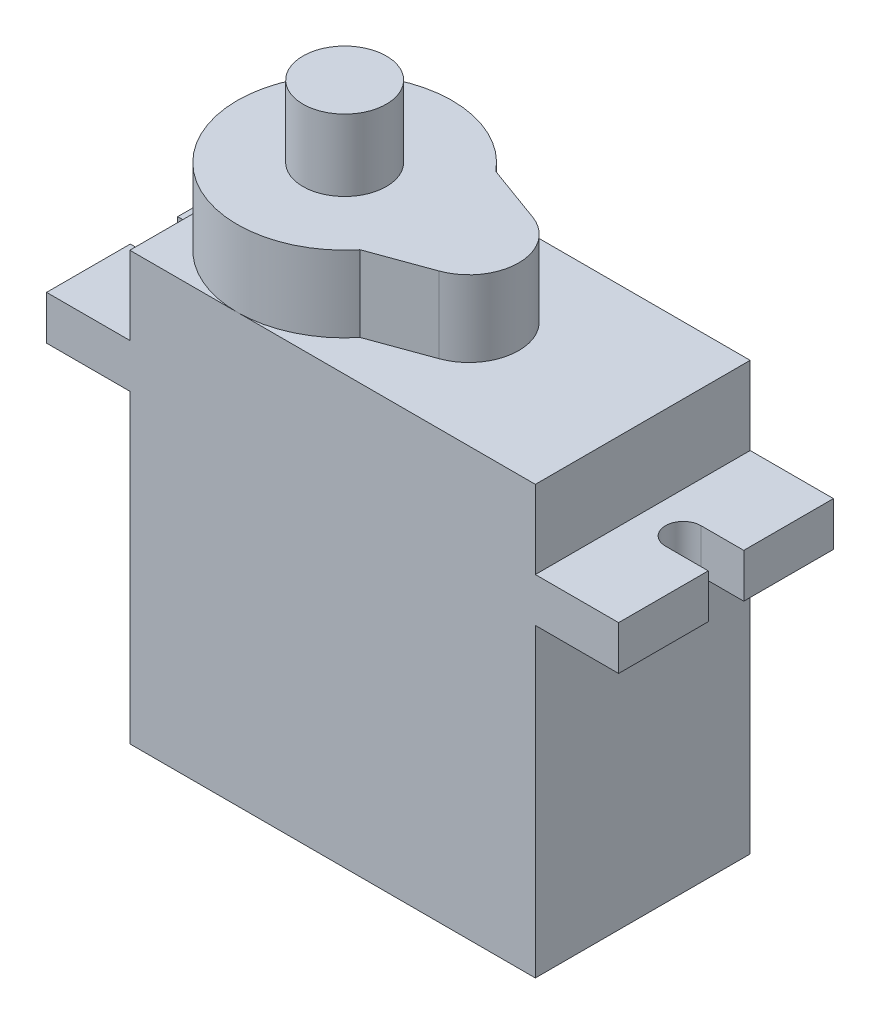
ISO-10303-21;
HEADER;
FILE_DESCRIPTION(('STEP AP214'),'2;1');
FILE_NAME('part.step','',(''),(''),'','','');
FILE_SCHEMA(('AUTOMOTIVE_DESIGN { 1 0 10303 214 1 1 1 1 }'));
ENDSEC;
DATA;
#1=APPLICATION_CONTEXT('core data for automotive mechanical design processes');
#2=APPLICATION_PROTOCOL_DEFINITION('international standard','automotive_design',2000,#1);
#3=PRODUCT_CONTEXT('',#1,'mechanical');
#4=PRODUCT('Part','Part','',(#3));
#5=PRODUCT_RELATED_PRODUCT_CATEGORY('part','',(#4));
#6=PRODUCT_DEFINITION_FORMATION('','',#4);
#7=PRODUCT_DEFINITION_CONTEXT('part definition',#1,'design');
#8=PRODUCT_DEFINITION('design','',#6,#7);
#9=PRODUCT_DEFINITION_SHAPE('','',#8);
#10=(LENGTH_UNIT() NAMED_UNIT(*) SI_UNIT(.MILLI.,.METRE.));
#11=(NAMED_UNIT(*) PLANE_ANGLE_UNIT() SI_UNIT($,.RADIAN.));
#12=(NAMED_UNIT(*) SI_UNIT($,.STERADIAN.) SOLID_ANGLE_UNIT());
#13=UNCERTAINTY_MEASURE_WITH_UNIT(LENGTH_MEASURE(1.E-05),#10,'distance_accuracy_value','');
#14=(GEOMETRIC_REPRESENTATION_CONTEXT(3) GLOBAL_UNCERTAINTY_ASSIGNED_CONTEXT((#13)) GLOBAL_UNIT_ASSIGNED_CONTEXT((#10,
#11,#12)) REPRESENTATION_CONTEXT('',''));
#15=CARTESIAN_POINT('',(0.,0.,0.));
#16=DIRECTION('',(0.,0.,1.));
#17=DIRECTION('',(1.,0.,0.));
#18=AXIS2_PLACEMENT_3D('',#15,#16,#17);
#19=CARTESIAN_POINT('',(0.,6.88,0.));
#20=DIRECTION('',(0.,1.,0.));
#21=DIRECTION('',(0.,0.,1.));
#22=AXIS2_PLACEMENT_3D('',#19,#20,#21);
#23=PLANE('',#22);
#24=CARTESIAN_POINT('',(0.,6.88,0.));
#25=DIRECTION('',(0.,1.,0.));
#26=DIRECTION('',(0.,0.,1.));
#27=AXIS2_PLACEMENT_3D('',#24,#25,#26);
#28=CIRCLE('',#27,6.05);
#29=CARTESIAN_POINT('',(4.69157810051004,6.88,-3.81989462247515));
#30=VERTEX_POINT('',#29);
#31=CARTESIAN_POINT('',(0.,6.88,-6.05));
#32=VERTEX_POINT('',#31);
#33=EDGE_CURVE('E50',#30,#32,#28,.T.);
#34=ORIENTED_EDGE('',*,*,#33,.F.);
#35=DIRECTION('',(0.939692620785908,0.,0.34202014332567));
#36=VECTOR('',#35,1.);
#37=CARTESIAN_POINT('',(1.77650085039546,6.88,-4.88089597210344));
#38=LINE('',#37,#36);
#39=CARTESIAN_POINT('',(7.95765640131187,6.88,-2.63113933820054));
#40=VERTEX_POINT('',#39);
#41=EDGE_CURVE('E57',#30,#40,#38,.T.);
#42=ORIENTED_EDGE('',*,*,#41,.T.);
#43=CARTESIAN_POINT('',(7.,6.88,0.));
#44=DIRECTION('',(0.,1.,0.));
#45=DIRECTION('',(0.,0.,1.));
#46=AXIS2_PLACEMENT_3D('',#43,#44,#45);
#47=CIRCLE('',#46,2.8);
#48=CARTESIAN_POINT('',(7.95765640131187,6.88,2.63113933820054));
#49=VERTEX_POINT('',#48);
#50=EDGE_CURVE('E62',#49,#40,#47,.T.);
#51=ORIENTED_EDGE('',*,*,#50,.F.);
#52=DIRECTION('',(0.939692620785908,0.,-0.34202014332567));
#53=VECTOR('',#52,1.);
#54=CARTESIAN_POINT('',(1.77650085039546,6.88,4.88089597210344));
#55=LINE('',#54,#53);
#56=CARTESIAN_POINT('',(4.69157810051004,6.88,3.81989462247515));
#57=VERTEX_POINT('',#56);
#58=EDGE_CURVE('E234',#57,#49,#55,.T.);
#59=ORIENTED_EDGE('',*,*,#58,.F.);
#60=CARTESIAN_POINT('',(0.,6.88,6.05));
#61=VERTEX_POINT('',#60);
#62=EDGE_CURVE('E235',#61,#57,#28,.T.);
#63=ORIENTED_EDGE('',*,*,#62,.F.);
#64=DIRECTION('',(-1.,0.,0.));
#65=VECTOR('',#64,1.);
#66=CARTESIAN_POINT('',(0.,6.88,6.05));
#67=LINE('',#66,#65);
#68=CARTESIAN_POINT('',(16.79,6.88,6.05));
#69=VERTEX_POINT('',#68);
#70=EDGE_CURVE('E263',#69,#61,#67,.T.);
#71=ORIENTED_EDGE('',*,*,#70,.F.);
#72=DIRECTION('',(0.,0.,-1.));
#73=VECTOR('',#72,1.);
#74=CARTESIAN_POINT('',(16.79,6.88,0.));
#75=LINE('',#74,#73);
#76=CARTESIAN_POINT('',(16.79,6.88,-6.05));
#77=VERTEX_POINT('',#76);
#78=EDGE_CURVE('E260',#69,#77,#75,.T.);
#79=ORIENTED_EDGE('',*,*,#78,.T.);
#80=DIRECTION('',(-1.,0.,0.));
#81=VECTOR('',#80,1.);
#82=CARTESIAN_POINT('',(0.,6.88,-6.05));
#83=LINE('',#82,#81);
#84=EDGE_CURVE('E257',#77,#32,#83,.T.);
#85=ORIENTED_EDGE('',*,*,#84,.T.);
#86=EDGE_LOOP('',(#34,#42,#51,#59,#63,#71,#79,#85));
#87=FACE_BOUND('',#86,.T.);
#88=ADVANCED_FACE('F39',(#87),#23,.T.);
#89=CARTESIAN_POINT('',(-6.05,6.88,0.));
#90=VERTEX_POINT('',#89);
#91=EDGE_CURVE('E11',#32,#90,#28,.T.);
#92=ORIENTED_EDGE('',*,*,#91,.F.);
#93=CARTESIAN_POINT('',(-6.05,6.88,-6.05));
#94=VERTEX_POINT('',#93);
#95=EDGE_CURVE('E255',#32,#94,#83,.T.);
#96=ORIENTED_EDGE('',*,*,#95,.T.);
#97=DIRECTION('',(0.,0.,-1.));
#98=VECTOR('',#97,1.);
#99=CARTESIAN_POINT('',(-6.05,6.88,0.));
#100=LINE('',#99,#98);
#101=EDGE_CURVE('E256',#90,#94,#100,.T.);
#102=ORIENTED_EDGE('',*,*,#101,.F.);
#103=EDGE_LOOP('',(#92,#96,#102));
#104=FACE_BOUND('',#103,.T.);
#105=ADVANCED_FACE('F411',(#104),#23,.T.);
#106=CARTESIAN_POINT('',(0.,2.48,0.));
#107=DIRECTION('',(0.,1.,0.));
#108=DIRECTION('',(0.,0.,1.));
#109=AXIS2_PLACEMENT_3D('',#106,#107,#108);
#110=PLANE('',#109);
#111=DIRECTION('',(1.,0.,0.));
#112=VECTOR('',#111,1.);
#113=CARTESIAN_POINT('',(0.,2.48,6.05));
#114=LINE('',#113,#112);
#115=CARTESIAN_POINT('',(-10.74,2.48,6.05));
#116=VERTEX_POINT('',#115);
#117=CARTESIAN_POINT('',(-6.05,2.48,6.05));
#118=VERTEX_POINT('',#117);
#119=EDGE_CURVE('E293',#116,#118,#114,.T.);
#120=ORIENTED_EDGE('',*,*,#119,.T.);
#121=DIRECTION('',(0.,0.,-1.));
#122=VECTOR('',#121,1.);
#123=CARTESIAN_POINT('',(-6.05,2.48,0.));
#124=LINE('',#123,#122);
#125=CARTESIAN_POINT('',(-6.05,2.48,-6.05));
#126=VERTEX_POINT('',#125);
#127=EDGE_CURVE('E247',#118,#126,#124,.T.);
#128=ORIENTED_EDGE('',*,*,#127,.T.);
#129=DIRECTION('',(1.,0.,0.));
#130=VECTOR('',#129,1.);
#131=CARTESIAN_POINT('',(0.,2.48,-6.05));
#132=LINE('',#131,#130);
#133=CARTESIAN_POINT('',(-10.74,2.48,-6.05));
#134=VERTEX_POINT('',#133);
#135=EDGE_CURVE('E296',#134,#126,#132,.T.);
#136=ORIENTED_EDGE('',*,*,#135,.F.);
#137=DIRECTION('',(0.,0.,1.));
#138=VECTOR('',#137,1.);
#139=CARTESIAN_POINT('',(-10.74,2.48,0.));
#140=LINE('',#139,#138);
#141=CARTESIAN_POINT('',(-10.74,2.48,-1.33332999047523));
#142=VERTEX_POINT('',#141);
#143=EDGE_CURVE('E292',#134,#142,#140,.T.);
#144=ORIENTED_EDGE('',*,*,#143,.T.);
#145=DIRECTION('',(-1.,0.,0.));
#146=VECTOR('',#145,1.);
#147=CARTESIAN_POINT('',(0.,2.48,-1.33332999047523));
#148=LINE('',#147,#146);
#149=CARTESIAN_POINT('',(-8.33,2.48,-1.33332999047523));
#150=VERTEX_POINT('',#149);
#151=EDGE_CURVE('E299',#150,#142,#148,.T.);
#152=ORIENTED_EDGE('',*,*,#151,.F.);
#153=CARTESIAN_POINT('',(-8.33,2.48,0.));
#154=DIRECTION('',(0.,1.,0.));
#155=DIRECTION('',(0.,0.,1.));
#156=AXIS2_PLACEMENT_3D('',#153,#154,#155);
#157=CIRCLE('',#156,1.33332999047523);
#158=CARTESIAN_POINT('',(-8.33,2.48,1.33332999047523));
#159=VERTEX_POINT('',#158);
#160=EDGE_CURVE('E283',#159,#150,#157,.T.);
#161=ORIENTED_EDGE('',*,*,#160,.F.);
#162=DIRECTION('',(-1.,0.,0.));
#163=VECTOR('',#162,1.);
#164=CARTESIAN_POINT('',(0.,2.48,1.33332999047523));
#165=LINE('',#164,#163);
#166=CARTESIAN_POINT('',(-10.74,2.48,1.33332999047523));
#167=VERTEX_POINT('',#166);
#168=EDGE_CURVE('E286',#159,#167,#165,.T.);
#169=ORIENTED_EDGE('',*,*,#168,.T.);
#170=EDGE_CURVE('E289',#167,#116,#140,.T.);
#171=ORIENTED_EDGE('',*,*,#170,.T.);
#172=EDGE_LOOP('',(#120,#128,#136,#144,#152,#161,#169,#171));
#173=FACE_BOUND('',#172,.T.);
#174=ADVANCED_FACE('F432',(#173),#110,.T.);
#175=CARTESIAN_POINT('',(-6.05,-17.2,-6.05));
#176=DIRECTION('',(0.,0.,1.));
#177=DIRECTION('',(1.,0.,0.));
#178=AXIS2_PLACEMENT_3D('',#175,#176,#177);
#179=PLANE('',#178);
#180=DIRECTION('',(0.,1.,0.));
#181=VECTOR('',#180,1.);
#182=CARTESIAN_POINT('',(-6.05,-17.2,-6.05));
#183=LINE('',#182,#181);
#184=CARTESIAN_POINT('',(-6.05,-17.2,-6.05));
#185=VERTEX_POINT('',#184);
#186=CARTESIAN_POINT('',(-6.05,0.,-6.05));
#187=VERTEX_POINT('',#186);
#188=EDGE_CURVE('E384',#185,#187,#183,.T.);
#189=ORIENTED_EDGE('',*,*,#188,.T.);
#190=DIRECTION('',(1.,0.,0.));
#191=VECTOR('',#190,1.);
#192=CARTESIAN_POINT('',(0.,0.,-6.05));
#193=LINE('',#192,#191);
#194=CARTESIAN_POINT('',(-10.74,0.,-6.05));
#195=VERTEX_POINT('',#194);
#196=EDGE_CURVE('E317',#195,#187,#193,.T.);
#197=ORIENTED_EDGE('',*,*,#196,.F.);
#198=DIRECTION('',(0.,-1.,0.));
#199=VECTOR('',#198,1.);
#200=CARTESIAN_POINT('',(-10.74,2.48,-6.05));
#201=LINE('',#200,#199);
#202=EDGE_CURVE('E324',#134,#195,#201,.T.);
#203=ORIENTED_EDGE('',*,*,#202,.F.);
#204=ORIENTED_EDGE('',*,*,#135,.T.);
#205=DIRECTION('',(0.,-1.,0.));
#206=VECTOR('',#205,1.);
#207=CARTESIAN_POINT('',(-6.05,6.88,-6.05));
#208=LINE('',#207,#206);
#209=EDGE_CURVE('E266',#94,#126,#208,.T.);
#210=ORIENTED_EDGE('',*,*,#209,.F.);
#211=ORIENTED_EDGE('',*,*,#95,.F.);
#212=ORIENTED_EDGE('',*,*,#84,.F.);
#213=DIRECTION('',(0.,-1.,0.));
#214=VECTOR('',#213,1.);
#215=CARTESIAN_POINT('',(16.79,6.88,-6.05));
#216=LINE('',#215,#214);
#217=CARTESIAN_POINT('',(16.79,2.48,-6.05));
#218=VERTEX_POINT('',#217);
#219=EDGE_CURVE('E278',#77,#218,#216,.T.);
#220=ORIENTED_EDGE('',*,*,#219,.T.);
#221=CARTESIAN_POINT('',(21.48,2.48,-6.05));
#222=VERTEX_POINT('',#221);
#223=EDGE_CURVE('E295',#218,#222,#132,.T.);
#224=ORIENTED_EDGE('',*,*,#223,.T.);
#225=DIRECTION('',(0.,-1.,0.));
#226=VECTOR('',#225,1.);
#227=CARTESIAN_POINT('',(21.48,2.48,-6.05));
#228=LINE('',#227,#226);
#229=CARTESIAN_POINT('',(21.48,0.,-6.05));
#230=VERTEX_POINT('',#229);
#231=EDGE_CURVE('E366',#222,#230,#228,.T.);
#232=ORIENTED_EDGE('',*,*,#231,.T.);
#233=CARTESIAN_POINT('',(16.79,0.,-6.05));
#234=VERTEX_POINT('',#233);
#235=EDGE_CURVE('E316',#234,#230,#193,.T.);
#236=ORIENTED_EDGE('',*,*,#235,.F.);
#237=DIRECTION('',(0.,1.,0.));
#238=VECTOR('',#237,1.);
#239=CARTESIAN_POINT('',(16.79,-17.2,-6.05));
#240=LINE('',#239,#238);
#241=CARTESIAN_POINT('',(16.79,-17.2,-6.05));
#242=VERTEX_POINT('',#241);
#243=EDGE_CURVE('E43',#242,#234,#240,.T.);
#244=ORIENTED_EDGE('',*,*,#243,.F.);
#245=DIRECTION('',(1.,0.,0.));
#246=VECTOR('',#245,1.);
#247=CARTESIAN_POINT('',(-6.05,-17.2,-6.05));
#248=LINE('',#247,#246);
#249=EDGE_CURVE('E372',#185,#242,#248,.T.);
#250=ORIENTED_EDGE('',*,*,#249,.F.);
#251=EDGE_LOOP('',(#189,#197,#203,#204,#210,#211,#212,#220,#224,#232,#236,#244,#250));
#252=FACE_BOUND('',#251,.T.);
#253=ADVANCED_FACE('F41',(#252),#179,.F.);
#254=CARTESIAN_POINT('',(16.79,-17.2,-6.05));
#255=DIRECTION('',(-1.,0.,0.));
#256=DIRECTION('',(0.,0.,1.));
#257=AXIS2_PLACEMENT_3D('',#254,#255,#256);
#258=PLANE('',#257);
#259=DIRECTION('',(0.,0.,1.));
#260=VECTOR('',#259,1.);
#261=CARTESIAN_POINT('',(16.79,0.,-6.05));
#262=LINE('',#261,#260);
#263=CARTESIAN_POINT('',(16.79,0.,6.05));
#264=VERTEX_POINT('',#263);
#265=EDGE_CURVE('E334',#234,#264,#262,.T.);
#266=ORIENTED_EDGE('',*,*,#265,.T.);
#267=DIRECTION('',(0.,1.,0.));
#268=VECTOR('',#267,1.);
#269=CARTESIAN_POINT('',(16.79,-17.2,6.05));
#270=LINE('',#269,#268);
#271=CARTESIAN_POINT('',(16.79,-17.2,6.05));
#272=VERTEX_POINT('',#271);
#273=EDGE_CURVE('E392',#272,#264,#270,.T.);
#274=ORIENTED_EDGE('',*,*,#273,.F.);
#275=DIRECTION('',(0.,0.,1.));
#276=VECTOR('',#275,1.);
#277=CARTESIAN_POINT('',(16.79,-17.2,-6.05));
#278=LINE('',#277,#276);
#279=EDGE_CURVE('E375',#242,#272,#278,.T.);
#280=ORIENTED_EDGE('',*,*,#279,.F.);
#281=ORIENTED_EDGE('',*,*,#243,.T.);
#282=EDGE_LOOP('',(#266,#274,#280,#281));
#283=FACE_BOUND('',#282,.T.);
#284=ADVANCED_FACE('F456',(#283),#258,.F.);
#285=CARTESIAN_POINT('',(-6.05,-17.2,6.05));
#286=DIRECTION('',(0.,0.,1.));
#287=DIRECTION('',(1.,0.,0.));
#288=AXIS2_PLACEMENT_3D('',#285,#286,#287);
#289=PLANE('',#288);
#290=ORIENTED_EDGE('',*,*,#273,.T.);
#291=DIRECTION('',(1.,0.,0.));
#292=VECTOR('',#291,1.);
#293=CARTESIAN_POINT('',(0.,0.,6.05));
#294=LINE('',#293,#292);
#295=CARTESIAN_POINT('',(21.48,0.,6.05));
#296=VERTEX_POINT('',#295);
#297=EDGE_CURVE('E311',#264,#296,#294,.T.);
#298=ORIENTED_EDGE('',*,*,#297,.T.);
#299=DIRECTION('',(0.,-1.,0.));
#300=VECTOR('',#299,1.);
#301=CARTESIAN_POINT('',(21.48,2.48,6.05));
#302=LINE('',#301,#300);
#303=CARTESIAN_POINT('',(21.48,2.48,6.05));
#304=VERTEX_POINT('',#303);
#305=EDGE_CURVE('E363',#304,#296,#302,.T.);
#306=ORIENTED_EDGE('',*,*,#305,.F.);
#307=CARTESIAN_POINT('',(16.79,2.48,6.05));
#308=VERTEX_POINT('',#307);
#309=EDGE_CURVE('E291',#308,#304,#114,.T.);
#310=ORIENTED_EDGE('',*,*,#309,.F.);
#311=DIRECTION('',(0.,-1.,0.));
#312=VECTOR('',#311,1.);
#313=CARTESIAN_POINT('',(16.79,6.88,6.05));
#314=LINE('',#313,#312);
#315=EDGE_CURVE('E275',#69,#308,#314,.T.);
#316=ORIENTED_EDGE('',*,*,#315,.F.);
#317=ORIENTED_EDGE('',*,*,#70,.T.);
#318=CARTESIAN_POINT('',(-6.05,6.88,6.05));
#319=VERTEX_POINT('',#318);
#320=EDGE_CURVE('E262',#61,#319,#67,.T.);
#321=ORIENTED_EDGE('',*,*,#320,.T.);
#322=DIRECTION('',(0.,-1.,0.));
#323=VECTOR('',#322,1.);
#324=CARTESIAN_POINT('',(-6.05,6.88,6.05));
#325=LINE('',#324,#323);
#326=EDGE_CURVE('E271',#319,#118,#325,.T.);
#327=ORIENTED_EDGE('',*,*,#326,.T.);
#328=ORIENTED_EDGE('',*,*,#119,.F.);
#329=DIRECTION('',(0.,-1.,0.));
#330=VECTOR('',#329,1.);
#331=CARTESIAN_POINT('',(-10.74,2.48,6.05));
#332=LINE('',#331,#330);
#333=CARTESIAN_POINT('',(-10.74,0.,6.05));
#334=VERTEX_POINT('',#333);
#335=EDGE_CURVE('E326',#116,#334,#332,.T.);
#336=ORIENTED_EDGE('',*,*,#335,.T.);
#337=CARTESIAN_POINT('',(-6.05,0.,6.05));
#338=VERTEX_POINT('',#337);
#339=EDGE_CURVE('E313',#334,#338,#294,.T.);
#340=ORIENTED_EDGE('',*,*,#339,.T.);
#341=DIRECTION('',(0.,1.,0.));
#342=VECTOR('',#341,1.);
#343=CARTESIAN_POINT('',(-6.05,-17.2,6.05));
#344=LINE('',#343,#342);
#345=CARTESIAN_POINT('',(-6.05,-17.2,6.05));
#346=VERTEX_POINT('',#345);
#347=EDGE_CURVE('E390',#346,#338,#344,.T.);
#348=ORIENTED_EDGE('',*,*,#347,.F.);
#349=DIRECTION('',(1.,0.,0.));
#350=VECTOR('',#349,1.);
#351=CARTESIAN_POINT('',(-6.05,-17.2,6.05));
#352=LINE('',#351,#350);
#353=EDGE_CURVE('E378',#346,#272,#352,.T.);
#354=ORIENTED_EDGE('',*,*,#353,.T.);
#355=EDGE_LOOP('',(#290,#298,#306,#310,#316,#317,#321,#327,#328,#336,#340,#348,#354));
#356=FACE_BOUND('',#355,.T.);
#357=ADVANCED_FACE('F419',(#356),#289,.T.);
#358=CARTESIAN_POINT('',(-6.05,-17.2,-6.05));
#359=DIRECTION('',(-1.,0.,0.));
#360=DIRECTION('',(0.,0.,1.));
#361=AXIS2_PLACEMENT_3D('',#358,#359,#360);
#362=PLANE('',#361);
#363=DIRECTION('',(0.,0.,1.));
#364=VECTOR('',#363,1.);
#365=CARTESIAN_POINT('',(-6.05,0.,-6.05));
#366=LINE('',#365,#364);
#367=EDGE_CURVE('E376',#187,#338,#366,.T.);
#368=ORIENTED_EDGE('',*,*,#367,.F.);
#369=ORIENTED_EDGE('',*,*,#188,.F.);
#370=DIRECTION('',(0.,0.,1.));
#371=VECTOR('',#370,1.);
#372=CARTESIAN_POINT('',(-6.05,-17.2,-6.05));
#373=LINE('',#372,#371);
#374=EDGE_CURVE('E381',#185,#346,#373,.T.);
#375=ORIENTED_EDGE('',*,*,#374,.T.);
#376=ORIENTED_EDGE('',*,*,#347,.T.);
#377=EDGE_LOOP('',(#368,#369,#375,#376));
#378=FACE_BOUND('',#377,.T.);
#379=ADVANCED_FACE('F450',(#378),#362,.T.);
#380=CARTESIAN_POINT('',(0.,-17.2,0.));
#381=DIRECTION('',(0.,-1.,0.));
#382=DIRECTION('',(0.,0.,-1.));
#383=AXIS2_PLACEMENT_3D('',#380,#381,#382);
#384=PLANE('',#383);
#385=ORIENTED_EDGE('',*,*,#249,.T.);
#386=ORIENTED_EDGE('',*,*,#279,.T.);
#387=ORIENTED_EDGE('',*,*,#353,.F.);
#388=ORIENTED_EDGE('',*,*,#374,.F.);
#389=EDGE_LOOP('',(#385,#386,#387,#388));
#390=FACE_BOUND('',#389,.T.);
#391=ADVANCED_FACE('F455',(#390),#384,.T.);
#392=CARTESIAN_POINT('',(0.,0.,0.));
#393=DIRECTION('',(0.,1.,0.));
#394=DIRECTION('',(0.,0.,1.));
#395=AXIS2_PLACEMENT_3D('',#392,#393,#394);
#396=PLANE('',#395);
#397=ORIENTED_EDGE('',*,*,#196,.T.);
#398=ORIENTED_EDGE('',*,*,#367,.T.);
#399=ORIENTED_EDGE('',*,*,#339,.F.);
#400=DIRECTION('',(0.,0.,1.));
#401=VECTOR('',#400,1.);
#402=CARTESIAN_POINT('',(-10.74,0.,0.));
#403=LINE('',#402,#401);
#404=CARTESIAN_POINT('',(-10.74,0.,1.33332999047523));
#405=VERTEX_POINT('',#404);
#406=EDGE_CURVE('E309',#405,#334,#403,.T.);
#407=ORIENTED_EDGE('',*,*,#406,.F.);
#408=DIRECTION('',(-1.,0.,0.));
#409=VECTOR('',#408,1.);
#410=CARTESIAN_POINT('',(0.,0.,1.33332999047523));
#411=LINE('',#410,#409);
#412=CARTESIAN_POINT('',(-8.33,0.,1.33332999047523));
#413=VERTEX_POINT('',#412);
#414=EDGE_CURVE('E306',#413,#405,#411,.T.);
#415=ORIENTED_EDGE('',*,*,#414,.F.);
#416=CARTESIAN_POINT('',(-8.33,0.,0.));
#417=DIRECTION('',(0.,1.,0.));
#418=DIRECTION('',(0.,0.,1.));
#419=AXIS2_PLACEMENT_3D('',#416,#417,#418);
#420=CIRCLE('',#419,1.33332999047523);
#421=CARTESIAN_POINT('',(-8.33,0.,-1.33332999047523));
#422=VERTEX_POINT('',#421);
#423=EDGE_CURVE('E303',#413,#422,#420,.T.);
#424=ORIENTED_EDGE('',*,*,#423,.T.);
#425=DIRECTION('',(-1.,0.,0.));
#426=VECTOR('',#425,1.);
#427=CARTESIAN_POINT('',(0.,0.,-1.33332999047523));
#428=LINE('',#427,#426);
#429=CARTESIAN_POINT('',(-10.74,0.,-1.33332999047523));
#430=VERTEX_POINT('',#429);
#431=EDGE_CURVE('E287',#422,#430,#428,.T.);
#432=ORIENTED_EDGE('',*,*,#431,.T.);
#433=EDGE_CURVE('E312',#195,#430,#403,.T.);
#434=ORIENTED_EDGE('',*,*,#433,.F.);
#435=EDGE_LOOP('',(#397,#398,#399,#407,#415,#424,#432,#434));
#436=FACE_BOUND('',#435,.T.);
#437=ADVANCED_FACE('F445',(#436),#396,.F.);
#438=CARTESIAN_POINT('',(-8.33,2.48,0.));
#439=DIRECTION('',(0.,-1.,0.));
#440=DIRECTION('',(0.,0.,-1.));
#441=AXIS2_PLACEMENT_3D('',#438,#439,#440);
#442=CYLINDRICAL_SURFACE('',#441,1.33332999047523);
#443=ORIENTED_EDGE('',*,*,#423,.F.);
#444=DIRECTION('',(0.,-1.,0.));
#445=VECTOR('',#444,1.);
#446=CARTESIAN_POINT('',(-8.33,2.48,1.33332999047523));
#447=LINE('',#446,#445);
#448=EDGE_CURVE('E332',#159,#413,#447,.T.);
#449=ORIENTED_EDGE('',*,*,#448,.F.);
#450=ORIENTED_EDGE('',*,*,#160,.T.);
#451=DIRECTION('',(0.,-1.,0.));
#452=VECTOR('',#451,1.);
#453=CARTESIAN_POINT('',(-8.33,2.48,-1.33332999047523));
#454=LINE('',#453,#452);
#455=EDGE_CURVE('E302',#150,#422,#454,.T.);
#456=ORIENTED_EDGE('',*,*,#455,.T.);
#457=EDGE_LOOP('',(#443,#449,#450,#456));
#458=FACE_BOUND('',#457,.T.);
#459=ADVANCED_FACE('F529',(#458),#442,.F.);
#460=CARTESIAN_POINT('',(0.,2.48,1.33332999047523));
#461=DIRECTION('',(0.,0.,1.));
#462=DIRECTION('',(1.,0.,0.));
#463=AXIS2_PLACEMENT_3D('',#460,#461,#462);
#464=PLANE('',#463);
#465=ORIENTED_EDGE('',*,*,#414,.T.);
#466=DIRECTION('',(0.,-1.,0.));
#467=VECTOR('',#466,1.);
#468=CARTESIAN_POINT('',(-10.74,2.48,1.33332999047523));
#469=LINE('',#468,#467);
#470=EDGE_CURVE('E329',#167,#405,#469,.T.);
#471=ORIENTED_EDGE('',*,*,#470,.F.);
#472=ORIENTED_EDGE('',*,*,#168,.F.);
#473=ORIENTED_EDGE('',*,*,#448,.T.);
#474=EDGE_LOOP('',(#465,#471,#472,#473));
#475=FACE_BOUND('',#474,.T.);
#476=ADVANCED_FACE('F526',(#475),#464,.F.);
#477=CARTESIAN_POINT('',(-10.74,2.48,0.));
#478=DIRECTION('',(1.,0.,0.));
#479=DIRECTION('',(0.,0.,-1.));
#480=AXIS2_PLACEMENT_3D('',#477,#478,#479);
#481=PLANE('',#480);
#482=ORIENTED_EDGE('',*,*,#406,.T.);
#483=ORIENTED_EDGE('',*,*,#335,.F.);
#484=ORIENTED_EDGE('',*,*,#170,.F.);
#485=ORIENTED_EDGE('',*,*,#470,.T.);
#486=EDGE_LOOP('',(#482,#483,#484,#485));
#487=FACE_BOUND('',#486,.T.);
#488=ADVANCED_FACE('F441',(#487),#481,.F.);
#489=ORIENTED_EDGE('',*,*,#433,.T.);
#490=DIRECTION('',(0.,-1.,0.));
#491=VECTOR('',#490,1.);
#492=CARTESIAN_POINT('',(-10.74,2.48,-1.33332999047523));
#493=LINE('',#492,#491);
#494=EDGE_CURVE('E322',#142,#430,#493,.T.);
#495=ORIENTED_EDGE('',*,*,#494,.F.);
#496=ORIENTED_EDGE('',*,*,#143,.F.);
#497=ORIENTED_EDGE('',*,*,#202,.T.);
#498=EDGE_LOOP('',(#489,#495,#496,#497));
#499=FACE_BOUND('',#498,.T.);
#500=ADVANCED_FACE('F521',(#499),#481,.F.);
#501=CARTESIAN_POINT('',(0.,2.48,-1.33332999047523));
#502=DIRECTION('',(0.,0.,1.));
#503=DIRECTION('',(1.,0.,0.));
#504=AXIS2_PLACEMENT_3D('',#501,#502,#503);
#505=PLANE('',#504);
#506=ORIENTED_EDGE('',*,*,#431,.F.);
#507=ORIENTED_EDGE('',*,*,#455,.F.);
#508=ORIENTED_EDGE('',*,*,#151,.T.);
#509=ORIENTED_EDGE('',*,*,#494,.T.);
#510=EDGE_LOOP('',(#506,#507,#508,#509));
#511=FACE_BOUND('',#510,.T.);
#512=ADVANCED_FACE('F516',(#511),#505,.T.);
#513=DIRECTION('',(0.,0.,-1.));
#514=VECTOR('',#513,1.);
#515=CARTESIAN_POINT('',(16.79,2.48,0.));
#516=LINE('',#515,#514);
#517=EDGE_CURVE('E268',#308,#218,#516,.T.);
#518=ORIENTED_EDGE('',*,*,#517,.F.);
#519=ORIENTED_EDGE('',*,*,#309,.T.);
#520=DIRECTION('',(0.,0.,1.));
#521=VECTOR('',#520,1.);
#522=CARTESIAN_POINT('',(21.48,2.48,0.));
#523=LINE('',#522,#521);
#524=CARTESIAN_POINT('',(21.48,2.48,0.999999999999997));
#525=VERTEX_POINT('',#524);
#526=EDGE_CURVE('E344',#525,#304,#523,.T.);
#527=ORIENTED_EDGE('',*,*,#526,.F.);
#528=DIRECTION('',(1.,0.,0.));
#529=VECTOR('',#528,1.);
#530=CARTESIAN_POINT('',(0.,2.48,0.999999999999997));
#531=LINE('',#530,#529);
#532=CARTESIAN_POINT('',(19.07,2.48,0.999999999999997));
#533=VERTEX_POINT('',#532);
#534=EDGE_CURVE('E345',#533,#525,#531,.T.);
#535=ORIENTED_EDGE('',*,*,#534,.F.);
#536=CARTESIAN_POINT('',(19.07,2.48,0.));
#537=DIRECTION('',(0.,1.,0.));
#538=DIRECTION('',(0.,0.,1.));
#539=AXIS2_PLACEMENT_3D('',#536,#537,#538);
#540=CIRCLE('',#539,1.);
#541=CARTESIAN_POINT('',(19.07,2.48,-1.00000000000001));
#542=VERTEX_POINT('',#541);
#543=EDGE_CURVE('E335',#542,#533,#540,.T.);
#544=ORIENTED_EDGE('',*,*,#543,.F.);
#545=DIRECTION('',(1.,0.,0.));
#546=VECTOR('',#545,1.);
#547=CARTESIAN_POINT('',(0.,2.48,-1.));
#548=LINE('',#547,#546);
#549=CARTESIAN_POINT('',(21.48,2.48,-1.00000000000001));
#550=VERTEX_POINT('',#549);
#551=EDGE_CURVE('E338',#542,#550,#548,.T.);
#552=ORIENTED_EDGE('',*,*,#551,.T.);
#553=EDGE_CURVE('E341',#222,#550,#523,.T.);
#554=ORIENTED_EDGE('',*,*,#553,.F.);
#555=ORIENTED_EDGE('',*,*,#223,.F.);
#556=EDGE_LOOP('',(#518,#519,#527,#535,#544,#552,#554,#555));
#557=FACE_BOUND('',#556,.T.);
#558=ADVANCED_FACE('F487',(#557),#110,.T.);
#559=ORIENTED_EDGE('',*,*,#265,.F.);
#560=ORIENTED_EDGE('',*,*,#235,.T.);
#561=DIRECTION('',(0.,0.,1.));
#562=VECTOR('',#561,1.);
#563=CARTESIAN_POINT('',(21.48,0.,0.));
#564=LINE('',#563,#562);
#565=CARTESIAN_POINT('',(21.48,0.,-1.00000000000001));
#566=VERTEX_POINT('',#565);
#567=EDGE_CURVE('E354',#230,#566,#564,.T.);
#568=ORIENTED_EDGE('',*,*,#567,.T.);
#569=DIRECTION('',(1.,0.,0.));
#570=VECTOR('',#569,1.);
#571=CARTESIAN_POINT('',(0.,0.,-1.));
#572=LINE('',#571,#570);
#573=CARTESIAN_POINT('',(19.07,0.,-1.00000000000001));
#574=VERTEX_POINT('',#573);
#575=EDGE_CURVE('E351',#574,#566,#572,.T.);
#576=ORIENTED_EDGE('',*,*,#575,.F.);
#577=CARTESIAN_POINT('',(19.07,0.,0.));
#578=DIRECTION('',(0.,1.,0.));
#579=DIRECTION('',(0.,0.,1.));
#580=AXIS2_PLACEMENT_3D('',#577,#578,#579);
#581=CIRCLE('',#580,1.);
#582=CARTESIAN_POINT('',(19.07,0.,0.999999999999997));
#583=VERTEX_POINT('',#582);
#584=EDGE_CURVE('E274',#574,#583,#581,.T.);
#585=ORIENTED_EDGE('',*,*,#584,.T.);
#586=DIRECTION('',(1.,0.,0.));
#587=VECTOR('',#586,1.);
#588=CARTESIAN_POINT('',(0.,0.,0.999999999999997));
#589=LINE('',#588,#587);
#590=CARTESIAN_POINT('',(21.48,0.,0.999999999999997));
#591=VERTEX_POINT('',#590);
#592=EDGE_CURVE('E339',#583,#591,#589,.T.);
#593=ORIENTED_EDGE('',*,*,#592,.T.);
#594=EDGE_CURVE('E357',#591,#296,#564,.T.);
#595=ORIENTED_EDGE('',*,*,#594,.T.);
#596=ORIENTED_EDGE('',*,*,#297,.F.);
#597=EDGE_LOOP('',(#559,#560,#568,#576,#585,#593,#595,#596));
#598=FACE_BOUND('',#597,.T.);
#599=ADVANCED_FACE('F459',(#598),#396,.F.);
#600=CARTESIAN_POINT('',(0.,2.48,0.999999999999997));
#601=DIRECTION('',(0.,0.,-1.));
#602=DIRECTION('',(-1.,0.,0.));
#603=AXIS2_PLACEMENT_3D('',#600,#601,#602);
#604=PLANE('',#603);
#605=ORIENTED_EDGE('',*,*,#592,.F.);
#606=DIRECTION('',(0.,-1.,0.));
#607=VECTOR('',#606,1.);
#608=CARTESIAN_POINT('',(19.07,2.48,0.999999999999997));
#609=LINE('',#608,#607);
#610=EDGE_CURVE('E348',#533,#583,#609,.T.);
#611=ORIENTED_EDGE('',*,*,#610,.F.);
#612=ORIENTED_EDGE('',*,*,#534,.T.);
#613=DIRECTION('',(0.,-1.,0.));
#614=VECTOR('',#613,1.);
#615=CARTESIAN_POINT('',(21.48,2.48,0.999999999999997));
#616=LINE('',#615,#614);
#617=EDGE_CURVE('E361',#525,#591,#616,.T.);
#618=ORIENTED_EDGE('',*,*,#617,.T.);
#619=EDGE_LOOP('',(#605,#611,#612,#618));
#620=FACE_BOUND('',#619,.T.);
#621=ADVANCED_FACE('F477',(#620),#604,.T.);
#622=CARTESIAN_POINT('',(21.48,2.48,0.));
#623=DIRECTION('',(1.,0.,0.));
#624=DIRECTION('',(0.,0.,-1.));
#625=AXIS2_PLACEMENT_3D('',#622,#623,#624);
#626=PLANE('',#625);
#627=ORIENTED_EDGE('',*,*,#567,.F.);
#628=ORIENTED_EDGE('',*,*,#231,.F.);
#629=ORIENTED_EDGE('',*,*,#553,.T.);
#630=DIRECTION('',(0.,-1.,0.));
#631=VECTOR('',#630,1.);
#632=CARTESIAN_POINT('',(21.48,2.48,-1.00000000000001));
#633=LINE('',#632,#631);
#634=EDGE_CURVE('E369',#550,#566,#633,.T.);
#635=ORIENTED_EDGE('',*,*,#634,.T.);
#636=EDGE_LOOP('',(#627,#628,#629,#635));
#637=FACE_BOUND('',#636,.T.);
#638=ADVANCED_FACE('F465',(#637),#626,.T.);
#639=CARTESIAN_POINT('',(0.,2.48,-1.));
#640=DIRECTION('',(0.,0.,-1.));
#641=DIRECTION('',(-1.,0.,0.));
#642=AXIS2_PLACEMENT_3D('',#639,#640,#641);
#643=PLANE('',#642);
#644=ORIENTED_EDGE('',*,*,#575,.T.);
#645=ORIENTED_EDGE('',*,*,#634,.F.);
#646=ORIENTED_EDGE('',*,*,#551,.F.);
#647=DIRECTION('',(0.,-1.,0.));
#648=VECTOR('',#647,1.);
#649=CARTESIAN_POINT('',(19.07,2.48,-1.00000000000001));
#650=LINE('',#649,#648);
#651=EDGE_CURVE('E307',#542,#574,#650,.T.);
#652=ORIENTED_EDGE('',*,*,#651,.T.);
#653=EDGE_LOOP('',(#644,#645,#646,#652));
#654=FACE_BOUND('',#653,.T.);
#655=ADVANCED_FACE('F488',(#654),#643,.F.);
#656=CARTESIAN_POINT('',(19.07,2.48,0.));
#657=DIRECTION('',(0.,-1.,0.));
#658=DIRECTION('',(0.,0.,-1.));
#659=AXIS2_PLACEMENT_3D('',#656,#657,#658);
#660=CYLINDRICAL_SURFACE('',#659,1.);
#661=ORIENTED_EDGE('',*,*,#584,.F.);
#662=ORIENTED_EDGE('',*,*,#651,.F.);
#663=ORIENTED_EDGE('',*,*,#543,.T.);
#664=ORIENTED_EDGE('',*,*,#610,.T.);
#665=EDGE_LOOP('',(#661,#662,#663,#664));
#666=FACE_BOUND('',#665,.T.);
#667=ADVANCED_FACE('F472',(#666),#660,.F.);
#668=ORIENTED_EDGE('',*,*,#594,.F.);
#669=ORIENTED_EDGE('',*,*,#617,.F.);
#670=ORIENTED_EDGE('',*,*,#526,.T.);
#671=ORIENTED_EDGE('',*,*,#305,.T.);
#672=EDGE_LOOP('',(#668,#669,#670,#671));
#673=FACE_BOUND('',#672,.T.);
#674=ADVANCED_FACE('F480',(#673),#626,.T.);
#675=CARTESIAN_POINT('',(-6.05,6.88,0.));
#676=DIRECTION('',(-1.,0.,0.));
#677=DIRECTION('',(0.,0.,1.));
#678=AXIS2_PLACEMENT_3D('',#675,#676,#677);
#679=PLANE('',#678);
#680=ORIENTED_EDGE('',*,*,#127,.F.);
#681=ORIENTED_EDGE('',*,*,#326,.F.);
#682=EDGE_CURVE('E252',#319,#90,#100,.T.);
#683=ORIENTED_EDGE('',*,*,#682,.T.);
#684=ORIENTED_EDGE('',*,*,#101,.T.);
#685=ORIENTED_EDGE('',*,*,#209,.T.);
#686=EDGE_LOOP('',(#680,#681,#683,#684,#685));
#687=FACE_BOUND('',#686,.T.);
#688=ADVANCED_FACE('F417',(#687),#679,.T.);
#689=CARTESIAN_POINT('',(16.79,6.88,0.));
#690=DIRECTION('',(-1.,0.,0.));
#691=DIRECTION('',(0.,0.,1.));
#692=AXIS2_PLACEMENT_3D('',#689,#690,#691);
#693=PLANE('',#692);
#694=ORIENTED_EDGE('',*,*,#517,.T.);
#695=ORIENTED_EDGE('',*,*,#219,.F.);
#696=ORIENTED_EDGE('',*,*,#78,.F.);
#697=ORIENTED_EDGE('',*,*,#315,.T.);
#698=EDGE_LOOP('',(#694,#695,#696,#697));
#699=FACE_BOUND('',#698,.T.);
#700=ADVANCED_FACE('F486',(#699),#693,.F.);
#701=EDGE_CURVE('E48',#90,#61,#28,.T.);
#702=ORIENTED_EDGE('',*,*,#701,.F.);
#703=ORIENTED_EDGE('',*,*,#682,.F.);
#704=ORIENTED_EDGE('',*,*,#320,.F.);
#705=EDGE_LOOP('',(#702,#703,#704));
#706=FACE_BOUND('',#705,.T.);
#707=ADVANCED_FACE('F408',(#706),#23,.T.);
#708=CARTESIAN_POINT('',(1.77650085039546,11.16,-4.88089597210344));
#709=DIRECTION('',(0.34202014332567,0.,-0.939692620785908));
#710=DIRECTION('',(-0.939692620785908,0.,-0.34202014332567));
#711=AXIS2_PLACEMENT_3D('',#708,#709,#710);
#712=PLANE('',#711);
#713=ORIENTED_EDGE('',*,*,#41,.F.);
#714=DIRECTION('',(0.,-1.,0.));
#715=VECTOR('',#714,1.);
#716=CARTESIAN_POINT('',(4.69157810051004,11.16,-3.81989462247515));
#717=LINE('',#716,#715);
#718=CARTESIAN_POINT('',(4.69157810051004,11.16,-3.81989462247515));
#719=VERTEX_POINT('',#718);
#720=EDGE_CURVE('E230',#719,#30,#717,.T.);
#721=ORIENTED_EDGE('',*,*,#720,.F.);
#722=DIRECTION('',(0.939692620785908,0.,0.34202014332567));
#723=VECTOR('',#722,1.);
#724=CARTESIAN_POINT('',(1.77650085039546,11.16,-4.88089597210344));
#725=LINE('',#724,#723);
#726=CARTESIAN_POINT('',(7.95765640131187,11.16,-2.63113933820054));
#727=VERTEX_POINT('',#726);
#728=EDGE_CURVE('E215',#719,#727,#725,.T.);
#729=ORIENTED_EDGE('',*,*,#728,.T.);
#730=DIRECTION('',(0.,-1.,0.));
#731=VECTOR('',#730,1.);
#732=CARTESIAN_POINT('',(7.95765640131187,11.16,-2.63113933820054));
#733=LINE('',#732,#731);
#734=EDGE_CURVE('E222',#727,#40,#733,.T.);
#735=ORIENTED_EDGE('',*,*,#734,.T.);
#736=EDGE_LOOP('',(#713,#721,#729,#735));
#737=FACE_BOUND('',#736,.T.);
#738=ADVANCED_FACE('F228',(#737),#712,.T.);
#739=CARTESIAN_POINT('',(0.,11.16,0.));
#740=DIRECTION('',(0.,-1.,0.));
#741=DIRECTION('',(0.,0.,-1.));
#742=AXIS2_PLACEMENT_3D('',#739,#740,#741);
#743=CYLINDRICAL_SURFACE('',#742,6.05);
#744=ORIENTED_EDGE('',*,*,#33,.T.);
#745=ORIENTED_EDGE('',*,*,#91,.T.);
#746=ORIENTED_EDGE('',*,*,#701,.T.);
#747=ORIENTED_EDGE('',*,*,#62,.T.);
#748=DIRECTION('',(0.,-1.,0.));
#749=VECTOR('',#748,1.);
#750=CARTESIAN_POINT('',(4.69157810051004,11.16,3.81989462247515));
#751=LINE('',#750,#749);
#752=CARTESIAN_POINT('',(4.69157810051004,11.16,3.81989462247515));
#753=VERTEX_POINT('',#752);
#754=EDGE_CURVE('E248',#753,#57,#751,.T.);
#755=ORIENTED_EDGE('',*,*,#754,.F.);
#756=CARTESIAN_POINT('',(0.,11.16,0.));
#757=DIRECTION('',(0.,1.,0.));
#758=DIRECTION('',(0.,0.,1.));
#759=AXIS2_PLACEMENT_3D('',#756,#757,#758);
#760=CIRCLE('',#759,6.05);
#761=EDGE_CURVE('E226',#719,#753,#760,.T.);
#762=ORIENTED_EDGE('',*,*,#761,.F.);
#763=ORIENTED_EDGE('',*,*,#720,.T.);
#764=EDGE_LOOP('',(#744,#745,#746,#747,#755,#762,#763));
#765=FACE_BOUND('',#764,.T.);
#766=ADVANCED_FACE('F403',(#765),#743,.T.);
#767=CARTESIAN_POINT('',(1.77650085039546,11.16,4.88089597210344));
#768=DIRECTION('',(-0.34202014332567,0.,-0.939692620785908));
#769=DIRECTION('',(-0.939692620785908,0.,0.34202014332567));
#770=AXIS2_PLACEMENT_3D('',#767,#768,#769);
#771=PLANE('',#770);
#772=ORIENTED_EDGE('',*,*,#58,.T.);
#773=DIRECTION('',(0.,-1.,0.));
#774=VECTOR('',#773,1.);
#775=CARTESIAN_POINT('',(7.95765640131187,11.16,2.63113933820054));
#776=LINE('',#775,#774);
#777=CARTESIAN_POINT('',(7.95765640131187,11.16,2.63113933820054));
#778=VERTEX_POINT('',#777);
#779=EDGE_CURVE('E225',#778,#49,#776,.T.);
#780=ORIENTED_EDGE('',*,*,#779,.F.);
#781=DIRECTION('',(0.939692620785908,0.,-0.34202014332567));
#782=VECTOR('',#781,1.);
#783=CARTESIAN_POINT('',(1.77650085039546,11.16,4.88089597210344));
#784=LINE('',#783,#782);
#785=EDGE_CURVE('E217',#753,#778,#784,.T.);
#786=ORIENTED_EDGE('',*,*,#785,.F.);
#787=ORIENTED_EDGE('',*,*,#754,.T.);
#788=EDGE_LOOP('',(#772,#780,#786,#787));
#789=FACE_BOUND('',#788,.T.);
#790=ADVANCED_FACE('F425',(#789),#771,.F.);
#791=CARTESIAN_POINT('',(7.,11.16,0.));
#792=DIRECTION('',(0.,-1.,0.));
#793=DIRECTION('',(0.,0.,-1.));
#794=AXIS2_PLACEMENT_3D('',#791,#792,#793);
#795=CYLINDRICAL_SURFACE('',#794,2.8);
#796=ORIENTED_EDGE('',*,*,#50,.T.);
#797=ORIENTED_EDGE('',*,*,#734,.F.);
#798=CARTESIAN_POINT('',(7.,11.16,0.));
#799=DIRECTION('',(0.,1.,0.));
#800=DIRECTION('',(0.,0.,1.));
#801=AXIS2_PLACEMENT_3D('',#798,#799,#800);
#802=CIRCLE('',#801,2.8);
#803=EDGE_CURVE('E211',#778,#727,#802,.T.);
#804=ORIENTED_EDGE('',*,*,#803,.F.);
#805=ORIENTED_EDGE('',*,*,#779,.T.);
#806=EDGE_LOOP('',(#796,#797,#804,#805));
#807=FACE_BOUND('',#806,.T.);
#808=ADVANCED_FACE('F223',(#807),#795,.T.);
#809=CARTESIAN_POINT('',(7.,11.16,0.));
#810=DIRECTION('',(0.,1.,0.));
#811=DIRECTION('',(0.,0.,1.));
#812=AXIS2_PLACEMENT_3D('',#809,#810,#811);
#813=PLANE('',#812);
#814=CARTESIAN_POINT('',(0.,11.16,0.));
#815=DIRECTION('',(0.,1.,0.));
#816=DIRECTION('',(0.,0.,1.));
#817=AXIS2_PLACEMENT_3D('',#814,#815,#816);
#818=CIRCLE('',#817,2.35);
#819=CARTESIAN_POINT('',(0.,11.16,2.35));
#820=VERTEX_POINT('',#819);
#821=EDGE_CURVE('E237',#820,#820,#818,.T.);
#822=ORIENTED_EDGE('',*,*,#821,.F.);
#823=EDGE_LOOP('',(#822));
#824=FACE_BOUND('',#823,.T.);
#825=ORIENTED_EDGE('',*,*,#728,.F.);
#826=ORIENTED_EDGE('',*,*,#761,.T.);
#827=ORIENTED_EDGE('',*,*,#785,.T.);
#828=ORIENTED_EDGE('',*,*,#803,.T.);
#829=EDGE_LOOP('',(#825,#826,#827,#828));
#830=FACE_BOUND('',#829,.T.);
#831=ADVANCED_FACE('F213',(#824,#830),#813,.T.);
#832=CARTESIAN_POINT('',(0.,15.18,0.));
#833=DIRECTION('',(0.,-1.,0.));
#834=DIRECTION('',(0.,0.,-1.));
#835=AXIS2_PLACEMENT_3D('',#832,#833,#834);
#836=CYLINDRICAL_SURFACE('',#835,2.35);
#837=CARTESIAN_POINT('',(0.,15.18,0.));
#838=DIRECTION('',(0.,1.,0.));
#839=DIRECTION('',(0.,0.,1.));
#840=AXIS2_PLACEMENT_3D('',#837,#838,#839);
#841=CIRCLE('',#840,2.35);
#842=CARTESIAN_POINT('',(0.,15.18,2.35));
#843=VERTEX_POINT('',#842);
#844=EDGE_CURVE('E243',#843,#843,#841,.T.);
#845=ORIENTED_EDGE('',*,*,#844,.F.);
#846=EDGE_LOOP('',(#845));
#847=FACE_BOUND('',#846,.T.);
#848=ORIENTED_EDGE('',*,*,#821,.T.);
#849=EDGE_LOOP('',(#848));
#850=FACE_BOUND('',#849,.T.);
#851=ADVANCED_FACE('F603',(#847,#850),#836,.T.);
#852=CARTESIAN_POINT('',(0.,15.18,0.));
#853=DIRECTION('',(0.,1.,0.));
#854=DIRECTION('',(0.,0.,1.));
#855=AXIS2_PLACEMENT_3D('',#852,#853,#854);
#856=PLANE('',#855);
#857=ORIENTED_EDGE('',*,*,#844,.T.);
#858=EDGE_LOOP('',(#857));
#859=FACE_BOUND('',#858,.T.);
#860=ADVANCED_FACE('F614',(#859),#856,.T.);
#861=CLOSED_SHELL('',(#88,#105,#174,#253,#284,#357,#379,#391,#437,#459,#476,#488,#500,#512,#558,
#599,#621,#638,#655,#667,#674,#688,#700,#707,#738,#766,#790,#808,#831,#851,#860));
#862=MANIFOLD_SOLID_BREP('B2',#861);
#863=ADVANCED_BREP_SHAPE_REPRESENTATION('',(#18,#862),#14);
#864=SHAPE_DEFINITION_REPRESENTATION(#9,#863);
ENDSEC;
END-ISO-10303-21;
